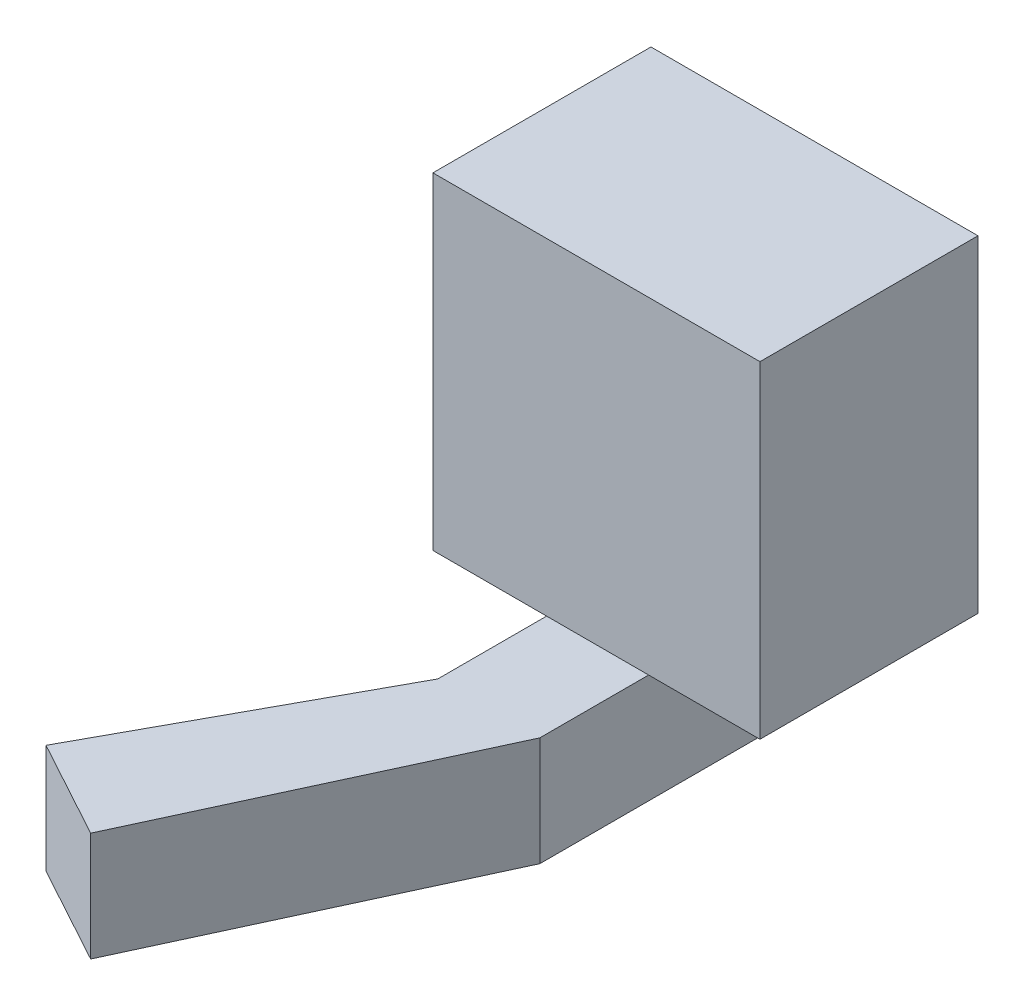
ISO-10303-21;
HEADER;
FILE_DESCRIPTION(('STEP AP214'),'2;1');
FILE_NAME('part.step','',(''),(''),'','','');
FILE_SCHEMA(('AUTOMOTIVE_DESIGN { 1 0 10303 214 1 1 1 1 }'));
ENDSEC;
DATA;
#1=APPLICATION_CONTEXT('core data for automotive mechanical design processes');
#2=APPLICATION_PROTOCOL_DEFINITION('international standard','automotive_design',2000,#1);
#3=PRODUCT_CONTEXT('',#1,'mechanical');
#4=PRODUCT('Part','Part','',(#3));
#5=PRODUCT_RELATED_PRODUCT_CATEGORY('part','',(#4));
#6=PRODUCT_DEFINITION_FORMATION('','',#4);
#7=PRODUCT_DEFINITION_CONTEXT('part definition',#1,'design');
#8=PRODUCT_DEFINITION('design','',#6,#7);
#9=PRODUCT_DEFINITION_SHAPE('','',#8);
#10=(LENGTH_UNIT() NAMED_UNIT(*) SI_UNIT(.MILLI.,.METRE.));
#11=(NAMED_UNIT(*) PLANE_ANGLE_UNIT() SI_UNIT($,.RADIAN.));
#12=(NAMED_UNIT(*) SI_UNIT($,.STERADIAN.) SOLID_ANGLE_UNIT());
#13=UNCERTAINTY_MEASURE_WITH_UNIT(LENGTH_MEASURE(1.E-05),#10,'distance_accuracy_value','');
#14=(GEOMETRIC_REPRESENTATION_CONTEXT(3) GLOBAL_UNCERTAINTY_ASSIGNED_CONTEXT((#13)) GLOBAL_UNIT_ASSIGNED_CONTEXT((#10,
#11,#12)) REPRESENTATION_CONTEXT('',''));
#15=CARTESIAN_POINT('',(0.,0.,0.));
#16=DIRECTION('',(0.,0.,1.));
#17=DIRECTION('',(1.,0.,0.));
#18=AXIS2_PLACEMENT_3D('',#15,#16,#17);
#19=CARTESIAN_POINT('',(0.,0.,20.));
#20=DIRECTION('',(0.,1.,0.));
#21=DIRECTION('',(0.,0.,1.));
#22=AXIS2_PLACEMENT_3D('',#19,#20,#21);
#23=PLANE('',#22);
#24=DIRECTION('',(0.,0.,-1.));
#25=VECTOR('',#24,1.);
#26=CARTESIAN_POINT('',(10.4279352962197,0.,5.69052009339638));
#27=LINE('',#26,#25);
#28=CARTESIAN_POINT('',(10.4279352962197,0.,20.));
#29=VERTEX_POINT('',#28);
#30=CARTESIAN_POINT('',(10.4279352962197,0.,5.69052009339638));
#31=VERTEX_POINT('',#30);
#32=EDGE_CURVE('E130',#29,#31,#27,.T.);
#33=ORIENTED_EDGE('',*,*,#32,.F.);
#34=DIRECTION('',(1.,0.,0.));
#35=VECTOR('',#34,1.);
#36=CARTESIAN_POINT('',(0.,0.,20.));
#37=LINE('',#36,#35);
#38=CARTESIAN_POINT('',(0.,0.,20.));
#39=VERTEX_POINT('',#38);
#40=EDGE_CURVE('E135',#39,#29,#37,.T.);
#41=ORIENTED_EDGE('',*,*,#40,.F.);
#42=DIRECTION('',(0.,0.,-1.));
#43=VECTOR('',#42,1.);
#44=CARTESIAN_POINT('',(0.,0.,20.));
#45=LINE('',#44,#43);
#46=CARTESIAN_POINT('',(0.,0.,0.));
#47=VERTEX_POINT('',#46);
#48=EDGE_CURVE('E11',#39,#47,#45,.T.);
#49=ORIENTED_EDGE('',*,*,#48,.T.);
#50=DIRECTION('',(1.,0.,0.));
#51=VECTOR('',#50,1.);
#52=CARTESIAN_POINT('',(0.,0.,0.));
#53=LINE('',#52,#51);
#54=CARTESIAN_POINT('',(30.,0.,0.));
#55=VERTEX_POINT('',#54);
#56=EDGE_CURVE('E155',#47,#55,#53,.T.);
#57=ORIENTED_EDGE('',*,*,#56,.T.);
#58=DIRECTION('',(0.,0.,-1.));
#59=VECTOR('',#58,1.);
#60=CARTESIAN_POINT('',(30.,0.,20.));
#61=LINE('',#60,#59);
#62=CARTESIAN_POINT('',(30.,0.,20.));
#63=VERTEX_POINT('',#62);
#64=EDGE_CURVE('E41',#63,#55,#61,.T.);
#65=ORIENTED_EDGE('',*,*,#64,.F.);
#66=CARTESIAN_POINT('',(19.7883110073375,0.,20.));
#67=VERTEX_POINT('',#66);
#68=EDGE_CURVE('E143',#67,#63,#37,.T.);
#69=ORIENTED_EDGE('',*,*,#68,.F.);
#70=DIRECTION('',(0.,0.,1.));
#71=VECTOR('',#70,1.);
#72=CARTESIAN_POINT('',(19.7883110073375,0.,5.69052009339638));
#73=LINE('',#72,#71);
#74=CARTESIAN_POINT('',(19.7883110073375,0.,5.69052009339638));
#75=VERTEX_POINT('',#74);
#76=EDGE_CURVE('E339',#75,#67,#73,.T.);
#77=ORIENTED_EDGE('',*,*,#76,.F.);
#78=DIRECTION('',(1.,0.,0.));
#79=VECTOR('',#78,1.);
#80=CARTESIAN_POINT('',(10.4279352962197,0.,5.69052009339638));
#81=LINE('',#80,#79);
#82=EDGE_CURVE('E48',#31,#75,#81,.T.);
#83=ORIENTED_EDGE('',*,*,#82,.F.);
#84=EDGE_LOOP('',(#33,#41,#49,#57,#65,#69,#77,#83));
#85=FACE_BOUND('',#84,.T.);
#86=ADVANCED_FACE('F33',(#85),#23,.F.);
#87=CARTESIAN_POINT('',(0.,0.,20.));
#88=DIRECTION('',(1.,0.,0.));
#89=DIRECTION('',(0.,0.,-1.));
#90=AXIS2_PLACEMENT_3D('',#87,#88,#89);
#91=PLANE('',#90);
#92=DIRECTION('',(0.,-1.,0.));
#93=VECTOR('',#92,1.);
#94=CARTESIAN_POINT('',(0.,0.,0.));
#95=LINE('',#94,#93);
#96=CARTESIAN_POINT('',(0.,30.,0.));
#97=VERTEX_POINT('',#96);
#98=EDGE_CURVE('E152',#97,#47,#95,.T.);
#99=ORIENTED_EDGE('',*,*,#98,.T.);
#100=ORIENTED_EDGE('',*,*,#48,.F.);
#101=DIRECTION('',(0.,-1.,0.));
#102=VECTOR('',#101,1.);
#103=CARTESIAN_POINT('',(0.,0.,20.));
#104=LINE('',#103,#102);
#105=CARTESIAN_POINT('',(0.,30.,20.));
#106=VERTEX_POINT('',#105);
#107=EDGE_CURVE('E140',#106,#39,#104,.T.);
#108=ORIENTED_EDGE('',*,*,#107,.F.);
#109=DIRECTION('',(0.,0.,-1.));
#110=VECTOR('',#109,1.);
#111=CARTESIAN_POINT('',(0.,30.,20.));
#112=LINE('',#111,#110);
#113=EDGE_CURVE('E151',#106,#97,#112,.T.);
#114=ORIENTED_EDGE('',*,*,#113,.T.);
#115=EDGE_LOOP('',(#99,#100,#108,#114));
#116=FACE_BOUND('',#115,.T.);
#117=ADVANCED_FACE('F35',(#116),#91,.F.);
#118=CARTESIAN_POINT('',(30.,0.,20.));
#119=DIRECTION('',(-1.,0.,0.));
#120=DIRECTION('',(0.,0.,1.));
#121=AXIS2_PLACEMENT_3D('',#118,#119,#120);
#122=PLANE('',#121);
#123=DIRECTION('',(0.,1.,0.));
#124=VECTOR('',#123,1.);
#125=CARTESIAN_POINT('',(30.,0.,0.));
#126=LINE('',#125,#124);
#127=CARTESIAN_POINT('',(30.,30.,0.));
#128=VERTEX_POINT('',#127);
#129=EDGE_CURVE('E158',#55,#128,#126,.T.);
#130=ORIENTED_EDGE('',*,*,#129,.T.);
#131=DIRECTION('',(0.,0.,-1.));
#132=VECTOR('',#131,1.);
#133=CARTESIAN_POINT('',(30.,30.,20.));
#134=LINE('',#133,#132);
#135=CARTESIAN_POINT('',(30.,30.,20.));
#136=VERTEX_POINT('',#135);
#137=EDGE_CURVE('E164',#136,#128,#134,.T.);
#138=ORIENTED_EDGE('',*,*,#137,.F.);
#139=DIRECTION('',(0.,1.,0.));
#140=VECTOR('',#139,1.);
#141=CARTESIAN_POINT('',(30.,0.,20.));
#142=LINE('',#141,#140);
#143=EDGE_CURVE('E142',#63,#136,#142,.T.);
#144=ORIENTED_EDGE('',*,*,#143,.F.);
#145=ORIENTED_EDGE('',*,*,#64,.T.);
#146=EDGE_LOOP('',(#130,#138,#144,#145));
#147=FACE_BOUND('',#146,.T.);
#148=ADVANCED_FACE('F171',(#147),#122,.F.);
#149=CARTESIAN_POINT('',(0.,30.,20.));
#150=DIRECTION('',(0.,-1.,0.));
#151=DIRECTION('',(0.,0.,-1.));
#152=AXIS2_PLACEMENT_3D('',#149,#150,#151);
#153=PLANE('',#152);
#154=DIRECTION('',(-1.,0.,0.));
#155=VECTOR('',#154,1.);
#156=CARTESIAN_POINT('',(0.,30.,0.));
#157=LINE('',#156,#155);
#158=EDGE_CURVE('E160',#128,#97,#157,.T.);
#159=ORIENTED_EDGE('',*,*,#158,.T.);
#160=ORIENTED_EDGE('',*,*,#113,.F.);
#161=DIRECTION('',(-1.,0.,0.));
#162=VECTOR('',#161,1.);
#163=CARTESIAN_POINT('',(0.,30.,20.));
#164=LINE('',#163,#162);
#165=EDGE_CURVE('E145',#136,#106,#164,.T.);
#166=ORIENTED_EDGE('',*,*,#165,.F.);
#167=ORIENTED_EDGE('',*,*,#137,.T.);
#168=EDGE_LOOP('',(#159,#160,#166,#167));
#169=FACE_BOUND('',#168,.T.);
#170=ADVANCED_FACE('F179',(#169),#153,.F.);
#171=CARTESIAN_POINT('',(0.,0.,20.));
#172=DIRECTION('',(0.,0.,-1.));
#173=DIRECTION('',(-1.,0.,0.));
#174=AXIS2_PLACEMENT_3D('',#171,#172,#173);
#175=PLANE('',#174);
#176=ORIENTED_EDGE('',*,*,#40,.T.);
#177=DIRECTION('',(1.,0.,0.));
#178=VECTOR('',#177,1.);
#179=CARTESIAN_POINT('',(10.4279352962197,0.,20.));
#180=LINE('',#179,#178);
#181=EDGE_CURVE('E116',#29,#67,#180,.T.);
#182=ORIENTED_EDGE('',*,*,#181,.T.);
#183=ORIENTED_EDGE('',*,*,#68,.T.);
#184=ORIENTED_EDGE('',*,*,#143,.T.);
#185=ORIENTED_EDGE('',*,*,#165,.T.);
#186=ORIENTED_EDGE('',*,*,#107,.T.);
#187=EDGE_LOOP('',(#176,#182,#183,#184,#185,#186));
#188=FACE_BOUND('',#187,.T.);
#189=ADVANCED_FACE('F138',(#188),#175,.F.);
#190=CARTESIAN_POINT('',(0.,0.,0.));
#191=DIRECTION('',(0.,0.,-1.));
#192=DIRECTION('',(-1.,0.,0.));
#193=AXIS2_PLACEMENT_3D('',#190,#191,#192);
#194=PLANE('',#193);
#195=ORIENTED_EDGE('',*,*,#98,.F.);
#196=ORIENTED_EDGE('',*,*,#158,.F.);
#197=ORIENTED_EDGE('',*,*,#129,.F.);
#198=ORIENTED_EDGE('',*,*,#56,.F.);
#199=EDGE_LOOP('',(#195,#196,#197,#198));
#200=FACE_BOUND('',#199,.T.);
#201=ADVANCED_FACE('F176',(#200),#194,.T.);
#202=CARTESIAN_POINT('',(10.4279352962197,-10.,5.69052009339638));
#203=DIRECTION('',(1.,0.,0.));
#204=DIRECTION('',(0.,0.,-1.));
#205=AXIS2_PLACEMENT_3D('',#202,#203,#204);
#206=PLANE('',#205);
#207=ORIENTED_EDGE('',*,*,#32,.T.);
#208=DIRECTION('',(0.,1.,0.));
#209=VECTOR('',#208,1.);
#210=CARTESIAN_POINT('',(10.4279352962197,-10.,5.69052009339638));
#211=LINE('',#210,#209);
#212=CARTESIAN_POINT('',(10.4279352962197,-10.,5.69052009339638));
#213=VERTEX_POINT('',#212);
#214=EDGE_CURVE('E156',#213,#31,#211,.T.);
#215=ORIENTED_EDGE('',*,*,#214,.F.);
#216=DIRECTION('',(0.,0.,-1.));
#217=VECTOR('',#216,1.);
#218=CARTESIAN_POINT('',(10.4279352962197,-10.,5.69052009339638));
#219=LINE('',#218,#217);
#220=CARTESIAN_POINT('',(10.4279352962197,-10.,29.9800504767653));
#221=VERTEX_POINT('',#220);
#222=EDGE_CURVE('E336',#221,#213,#219,.T.);
#223=ORIENTED_EDGE('',*,*,#222,.F.);
#224=DIRECTION('',(0.,-1.,0.));
#225=VECTOR('',#224,1.);
#226=CARTESIAN_POINT('',(10.4279352962197,0.,29.9800504767653));
#227=LINE('',#226,#225);
#228=CARTESIAN_POINT('',(10.4279352962197,0.,29.9800504767653));
#229=VERTEX_POINT('',#228);
#230=EDGE_CURVE('E132',#229,#221,#227,.T.);
#231=ORIENTED_EDGE('',*,*,#230,.F.);
#232=DIRECTION('',(0.,0.,-1.));
#233=VECTOR('',#232,1.);
#234=CARTESIAN_POINT('',(10.4279352962197,0.,20.));
#235=LINE('',#234,#233);
#236=EDGE_CURVE('E120',#229,#29,#235,.T.);
#237=ORIENTED_EDGE('',*,*,#236,.T.);
#238=EDGE_LOOP('',(#207,#215,#223,#231,#237));
#239=FACE_BOUND('',#238,.T.);
#240=ADVANCED_FACE('F128',(#239),#206,.F.);
#241=CARTESIAN_POINT('',(10.4279352962197,-10.,5.69052009339638));
#242=DIRECTION('',(0.,0.,1.));
#243=DIRECTION('',(1.,0.,0.));
#244=AXIS2_PLACEMENT_3D('',#241,#242,#243);
#245=PLANE('',#244);
#246=ORIENTED_EDGE('',*,*,#82,.T.);
#247=DIRECTION('',(0.,1.,0.));
#248=VECTOR('',#247,1.);
#249=CARTESIAN_POINT('',(19.7883110073375,-10.,5.69052009339638));
#250=LINE('',#249,#248);
#251=CARTESIAN_POINT('',(19.7883110073375,-10.,5.69052009339638));
#252=VERTEX_POINT('',#251);
#253=EDGE_CURVE('E342',#252,#75,#250,.T.);
#254=ORIENTED_EDGE('',*,*,#253,.F.);
#255=DIRECTION('',(1.,0.,0.));
#256=VECTOR('',#255,1.);
#257=CARTESIAN_POINT('',(10.4279352962197,-10.,5.69052009339638));
#258=LINE('',#257,#256);
#259=EDGE_CURVE('E338',#213,#252,#258,.T.);
#260=ORIENTED_EDGE('',*,*,#259,.F.);
#261=ORIENTED_EDGE('',*,*,#214,.T.);
#262=EDGE_LOOP('',(#246,#254,#260,#261));
#263=FACE_BOUND('',#262,.T.);
#264=ADVANCED_FACE('F199',(#263),#245,.F.);
#265=CARTESIAN_POINT('',(19.7883110073375,-10.,5.69052009339638));
#266=DIRECTION('',(-1.,0.,0.));
#267=DIRECTION('',(0.,0.,1.));
#268=AXIS2_PLACEMENT_3D('',#265,#266,#267);
#269=PLANE('',#268);
#270=ORIENTED_EDGE('',*,*,#76,.T.);
#271=DIRECTION('',(0.,0.,1.));
#272=VECTOR('',#271,1.);
#273=CARTESIAN_POINT('',(19.7883110073375,0.,20.));
#274=LINE('',#273,#272);
#275=CARTESIAN_POINT('',(19.7883110073375,0.,29.9800504767653));
#276=VERTEX_POINT('',#275);
#277=EDGE_CURVE('E56',#67,#276,#274,.T.);
#278=ORIENTED_EDGE('',*,*,#277,.T.);
#279=DIRECTION('',(0.,-1.,0.));
#280=VECTOR('',#279,1.);
#281=CARTESIAN_POINT('',(19.7883110073375,0.,29.9800504767653));
#282=LINE('',#281,#280);
#283=CARTESIAN_POINT('',(19.7883110073375,-10.,29.9800504767653));
#284=VERTEX_POINT('',#283);
#285=EDGE_CURVE('E332',#276,#284,#282,.T.);
#286=ORIENTED_EDGE('',*,*,#285,.T.);
#287=DIRECTION('',(0.,0.,1.));
#288=VECTOR('',#287,1.);
#289=CARTESIAN_POINT('',(19.7883110073375,-10.,5.69052009339638));
#290=LINE('',#289,#288);
#291=EDGE_CURVE('E341',#252,#284,#290,.T.);
#292=ORIENTED_EDGE('',*,*,#291,.F.);
#293=ORIENTED_EDGE('',*,*,#253,.T.);
#294=EDGE_LOOP('',(#270,#278,#286,#292,#293));
#295=FACE_BOUND('',#294,.T.);
#296=ADVANCED_FACE('F202',(#295),#269,.F.);
#297=CARTESIAN_POINT('',(0.,-10.,0.));
#298=DIRECTION('',(0.,1.,0.));
#299=DIRECTION('',(0.,0.,1.));
#300=AXIS2_PLACEMENT_3D('',#297,#298,#299);
#301=PLANE('',#300);
#302=ORIENTED_EDGE('',*,*,#222,.T.);
#303=ORIENTED_EDGE('',*,*,#259,.T.);
#304=ORIENTED_EDGE('',*,*,#291,.T.);
#305=DIRECTION('',(-0.419702316001291,0.,0.907661812539865));
#306=VECTOR('',#305,1.);
#307=CARTESIAN_POINT('',(6.75966218601412,-10.,58.1562280989812));
#308=LINE('',#307,#306);
#309=CARTESIAN_POINT('',(6.75966218601412,-10.,58.1562280989812));
#310=VERTEX_POINT('',#309);
#311=EDGE_CURVE('E324',#284,#310,#308,.T.);
#312=ORIENTED_EDGE('',*,*,#311,.T.);
#313=DIRECTION('',(-0.877631099171331,0.,-0.479336681015883));
#314=VECTOR('',#313,1.);
#315=CARTESIAN_POINT('',(-2.26807686634554,-10.,53.2255385660767));
#316=LINE('',#315,#314);
#317=CARTESIAN_POINT('',(-2.26807686634554,-10.,53.2255385660767));
#318=VERTEX_POINT('',#317);
#319=EDGE_CURVE('E322',#310,#318,#316,.T.);
#320=ORIENTED_EDGE('',*,*,#319,.T.);
#321=DIRECTION('',(0.479336681015882,0.,-0.877631099171331));
#322=VECTOR('',#321,1.);
#323=CARTESIAN_POINT('',(10.4279352962197,-10.,29.9800504767653));
#324=LINE('',#323,#322);
#325=EDGE_CURVE('E133',#318,#221,#324,.T.);
#326=ORIENTED_EDGE('',*,*,#325,.T.);
#327=EDGE_LOOP('',(#302,#303,#304,#312,#320,#326));
#328=FACE_BOUND('',#327,.T.);
#329=ADVANCED_FACE('F206',(#328),#301,.F.);
#330=CARTESIAN_POINT('',(10.4279352962197,0.,29.9800504767653));
#331=DIRECTION('',(-0.877631099171331,0.,-0.479336681015883));
#332=DIRECTION('',(-0.479336681015883,0.,0.877631099171331));
#333=AXIS2_PLACEMENT_3D('',#330,#331,#332);
#334=PLANE('',#333);
#335=ORIENTED_EDGE('',*,*,#325,.F.);
#336=DIRECTION('',(0.,-1.,0.));
#337=VECTOR('',#336,1.);
#338=CARTESIAN_POINT('',(-2.26807686634554,0.,53.2255385660767));
#339=LINE('',#338,#337);
#340=CARTESIAN_POINT('',(-2.26807686634554,0.,53.2255385660767));
#341=VERTEX_POINT('',#340);
#342=EDGE_CURVE('E318',#341,#318,#339,.T.);
#343=ORIENTED_EDGE('',*,*,#342,.F.);
#344=DIRECTION('',(0.479336681015882,0.,-0.877631099171331));
#345=VECTOR('',#344,1.);
#346=CARTESIAN_POINT('',(10.4279352962197,0.,29.9800504767653));
#347=LINE('',#346,#345);
#348=EDGE_CURVE('E335',#341,#229,#347,.T.);
#349=ORIENTED_EDGE('',*,*,#348,.T.);
#350=ORIENTED_EDGE('',*,*,#230,.T.);
#351=EDGE_LOOP('',(#335,#343,#349,#350));
#352=FACE_BOUND('',#351,.T.);
#353=ADVANCED_FACE('F210',(#352),#334,.T.);
#354=CARTESIAN_POINT('',(-2.26807686634554,0.,53.2255385660767));
#355=DIRECTION('',(-0.479336681015883,0.,0.877631099171331));
#356=DIRECTION('',(0.877631099171331,0.,0.479336681015883));
#357=AXIS2_PLACEMENT_3D('',#354,#355,#356);
#358=PLANE('',#357);
#359=ORIENTED_EDGE('',*,*,#319,.F.);
#360=DIRECTION('',(0.,-1.,0.));
#361=VECTOR('',#360,1.);
#362=CARTESIAN_POINT('',(6.75966218601412,0.,58.1562280989812));
#363=LINE('',#362,#361);
#364=CARTESIAN_POINT('',(6.75966218601412,0.,58.1562280989812));
#365=VERTEX_POINT('',#364);
#366=EDGE_CURVE('E330',#365,#310,#363,.T.);
#367=ORIENTED_EDGE('',*,*,#366,.F.);
#368=DIRECTION('',(-0.877631099171331,0.,-0.479336681015883));
#369=VECTOR('',#368,1.);
#370=CARTESIAN_POINT('',(-2.26807686634554,0.,53.2255385660767));
#371=LINE('',#370,#369);
#372=EDGE_CURVE('E356',#365,#341,#371,.T.);
#373=ORIENTED_EDGE('',*,*,#372,.T.);
#374=ORIENTED_EDGE('',*,*,#342,.T.);
#375=EDGE_LOOP('',(#359,#367,#373,#374));
#376=FACE_BOUND('',#375,.T.);
#377=ADVANCED_FACE('F215',(#376),#358,.T.);
#378=CARTESIAN_POINT('',(6.75966218601412,0.,58.1562280989812));
#379=DIRECTION('',(0.907661812539865,0.,0.419702316001291));
#380=DIRECTION('',(0.419702316001291,0.,-0.907661812539865));
#381=AXIS2_PLACEMENT_3D('',#378,#379,#380);
#382=PLANE('',#381);
#383=ORIENTED_EDGE('',*,*,#311,.F.);
#384=ORIENTED_EDGE('',*,*,#285,.F.);
#385=DIRECTION('',(-0.419702316001291,0.,0.907661812539865));
#386=VECTOR('',#385,1.);
#387=CARTESIAN_POINT('',(6.75966218601412,0.,58.1562280989812));
#388=LINE('',#387,#386);
#389=EDGE_CURVE('E358',#276,#365,#388,.T.);
#390=ORIENTED_EDGE('',*,*,#389,.T.);
#391=ORIENTED_EDGE('',*,*,#366,.T.);
#392=EDGE_LOOP('',(#383,#384,#390,#391));
#393=FACE_BOUND('',#392,.T.);
#394=ADVANCED_FACE('F212',(#393),#382,.T.);
#395=CARTESIAN_POINT('',(0.,0.,0.));
#396=DIRECTION('',(0.,1.,0.));
#397=DIRECTION('',(0.,0.,1.));
#398=AXIS2_PLACEMENT_3D('',#395,#396,#397);
#399=PLANE('',#398);
#400=ORIENTED_EDGE('',*,*,#236,.F.);
#401=ORIENTED_EDGE('',*,*,#348,.F.);
#402=ORIENTED_EDGE('',*,*,#372,.F.);
#403=ORIENTED_EDGE('',*,*,#389,.F.);
#404=ORIENTED_EDGE('',*,*,#277,.F.);
#405=ORIENTED_EDGE('',*,*,#181,.F.);
#406=EDGE_LOOP('',(#400,#401,#402,#403,#404,#405));
#407=FACE_BOUND('',#406,.T.);
#408=ADVANCED_FACE('F118',(#407),#399,.T.);
#409=CLOSED_SHELL('',(#86,#117,#148,#170,#189,#201,#240,#264,#296,#329,#353,#377,#394,#408));
#410=MANIFOLD_SOLID_BREP('B2',#409);
#411=ADVANCED_BREP_SHAPE_REPRESENTATION('',(#18,#410),#14);
#412=SHAPE_DEFINITION_REPRESENTATION(#9,#411);
ENDSEC;
END-ISO-10303-21;
